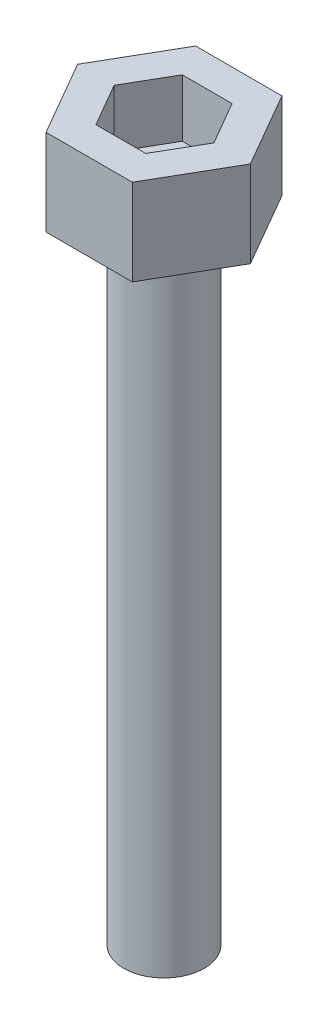
ISO-10303-21;
HEADER;
FILE_DESCRIPTION(('STEP AP214'),'2;1');
FILE_NAME('part.step','',(''),(''),'','','');
FILE_SCHEMA(('AUTOMOTIVE_DESIGN { 1 0 10303 214 1 1 1 1 }'));
ENDSEC;
DATA;
#1=APPLICATION_CONTEXT('core data for automotive mechanical design processes');
#2=APPLICATION_PROTOCOL_DEFINITION('international standard','automotive_design',2000,#1);
#3=PRODUCT_CONTEXT('',#1,'mechanical');
#4=PRODUCT('Part','Part','',(#3));
#5=PRODUCT_RELATED_PRODUCT_CATEGORY('part','',(#4));
#6=PRODUCT_DEFINITION_FORMATION('','',#4);
#7=PRODUCT_DEFINITION_CONTEXT('part definition',#1,'design');
#8=PRODUCT_DEFINITION('design','',#6,#7);
#9=PRODUCT_DEFINITION_SHAPE('','',#8);
#10=(LENGTH_UNIT() NAMED_UNIT(*) SI_UNIT(.MILLI.,.METRE.));
#11=(NAMED_UNIT(*) PLANE_ANGLE_UNIT() SI_UNIT($,.RADIAN.));
#12=(NAMED_UNIT(*) SI_UNIT($,.STERADIAN.) SOLID_ANGLE_UNIT());
#13=UNCERTAINTY_MEASURE_WITH_UNIT(LENGTH_MEASURE(1.E-05),#10,'distance_accuracy_value','');
#14=(GEOMETRIC_REPRESENTATION_CONTEXT(3) GLOBAL_UNCERTAINTY_ASSIGNED_CONTEXT((#13)) GLOBAL_UNIT_ASSIGNED_CONTEXT((#10,
#11,#12)) REPRESENTATION_CONTEXT('',''));
#15=CARTESIAN_POINT('',(0.,0.,0.));
#16=DIRECTION('',(0.,0.,1.));
#17=DIRECTION('',(1.,0.,0.));
#18=AXIS2_PLACEMENT_3D('',#15,#16,#17);
#19=CARTESIAN_POINT('',(0.,22.,0.));
#20=DIRECTION('',(0.,-1.,0.));
#21=DIRECTION('',(0.,0.,-1.));
#22=AXIS2_PLACEMENT_3D('',#19,#20,#21);
#23=CYLINDRICAL_SURFACE('',#22,1.4);
#24=CARTESIAN_POINT('',(0.,22.,0.));
#25=DIRECTION('',(0.,1.,0.));
#26=DIRECTION('',(0.,0.,1.));
#27=AXIS2_PLACEMENT_3D('',#24,#25,#26);
#28=CIRCLE('',#27,1.4);
#29=CARTESIAN_POINT('',(0.,22.,1.4));
#30=VERTEX_POINT('',#29);
#31=EDGE_CURVE('E11',#30,#30,#28,.T.);
#32=ORIENTED_EDGE('',*,*,#31,.F.);
#33=EDGE_LOOP('',(#32));
#34=FACE_BOUND('',#33,.T.);
#35=CARTESIAN_POINT('',(0.,0.,0.));
#36=DIRECTION('',(0.,1.,0.));
#37=DIRECTION('',(0.,0.,1.));
#38=AXIS2_PLACEMENT_3D('',#35,#36,#37);
#39=CIRCLE('',#38,1.4);
#40=CARTESIAN_POINT('',(0.,0.,1.4));
#41=VERTEX_POINT('',#40);
#42=EDGE_CURVE('E48',#41,#41,#39,.T.);
#43=ORIENTED_EDGE('',*,*,#42,.T.);
#44=EDGE_LOOP('',(#43));
#45=FACE_BOUND('',#44,.T.);
#46=ADVANCED_FACE('F45',(#34,#45),#23,.T.);
#47=CARTESIAN_POINT('',(0.,0.,0.));
#48=DIRECTION('',(0.,1.,0.));
#49=DIRECTION('',(0.,0.,1.));
#50=AXIS2_PLACEMENT_3D('',#47,#48,#49);
#51=PLANE('',#50);
#52=ORIENTED_EDGE('',*,*,#42,.F.);
#53=EDGE_LOOP('',(#52));
#54=FACE_BOUND('',#53,.T.);
#55=ADVANCED_FACE('F184',(#54),#51,.F.);
#56=CARTESIAN_POINT('',(1.50000000000003,25.,2.5980762113533));
#57=DIRECTION('',(-0.866025403784441,0.,-0.499999999999995));
#58=DIRECTION('',(-0.499999999999995,0.,0.866025403784441));
#59=AXIS2_PLACEMENT_3D('',#56,#57,#58);
#60=PLANE('',#59);
#61=DIRECTION('',(0.499999999999995,0.,-0.866025403784441));
#62=VECTOR('',#61,1.);
#63=CARTESIAN_POINT('',(1.50000000000003,22.,2.5980762113533));
#64=LINE('',#63,#62);
#65=CARTESIAN_POINT('',(1.50000000000003,22.,2.5980762113533));
#66=VERTEX_POINT('',#65);
#67=CARTESIAN_POINT('',(3.,22.,0.));
#68=VERTEX_POINT('',#67);
#69=EDGE_CURVE('E147',#66,#68,#64,.T.);
#70=ORIENTED_EDGE('',*,*,#69,.T.);
#71=DIRECTION('',(0.,-1.,0.));
#72=VECTOR('',#71,1.);
#73=CARTESIAN_POINT('',(3.,25.,0.));
#74=LINE('',#73,#72);
#75=CARTESIAN_POINT('',(3.,25.,0.));
#76=VERTEX_POINT('',#75);
#77=EDGE_CURVE('E176',#76,#68,#74,.T.);
#78=ORIENTED_EDGE('',*,*,#77,.F.);
#79=DIRECTION('',(0.499999999999995,0.,-0.866025403784441));
#80=VECTOR('',#79,1.);
#81=CARTESIAN_POINT('',(1.50000000000003,25.,2.5980762113533));
#82=LINE('',#81,#80);
#83=CARTESIAN_POINT('',(1.50000000000003,25.,2.5980762113533));
#84=VERTEX_POINT('',#83);
#85=EDGE_CURVE('E165',#84,#76,#82,.T.);
#86=ORIENTED_EDGE('',*,*,#85,.F.);
#87=DIRECTION('',(0.,-1.,0.));
#88=VECTOR('',#87,1.);
#89=CARTESIAN_POINT('',(1.50000000000003,25.,2.5980762113533));
#90=LINE('',#89,#88);
#91=EDGE_CURVE('E143',#84,#66,#90,.T.);
#92=ORIENTED_EDGE('',*,*,#91,.T.);
#93=EDGE_LOOP('',(#70,#78,#86,#92));
#94=FACE_BOUND('',#93,.T.);
#95=ADVANCED_FACE('F186',(#94),#60,.F.);
#96=CARTESIAN_POINT('',(3.,25.,0.));
#97=DIRECTION('',(-0.866025403784438,0.,0.500000000000001));
#98=DIRECTION('',(0.500000000000001,0.,0.866025403784438));
#99=AXIS2_PLACEMENT_3D('',#96,#97,#98);
#100=PLANE('',#99);
#101=DIRECTION('',(-0.500000000000001,0.,-0.866025403784438));
#102=VECTOR('',#101,1.);
#103=CARTESIAN_POINT('',(3.,22.,0.));
#104=LINE('',#103,#102);
#105=CARTESIAN_POINT('',(1.49999999999999,22.,-2.59807621135332));
#106=VERTEX_POINT('',#105);
#107=EDGE_CURVE('E151',#68,#106,#104,.T.);
#108=ORIENTED_EDGE('',*,*,#107,.T.);
#109=DIRECTION('',(0.,-1.,0.));
#110=VECTOR('',#109,1.);
#111=CARTESIAN_POINT('',(1.49999999999999,25.,-2.59807621135332));
#112=LINE('',#111,#110);
#113=CARTESIAN_POINT('',(1.49999999999999,25.,-2.59807621135332));
#114=VERTEX_POINT('',#113);
#115=EDGE_CURVE('E172',#114,#106,#112,.T.);
#116=ORIENTED_EDGE('',*,*,#115,.F.);
#117=DIRECTION('',(-0.500000000000001,0.,-0.866025403784438));
#118=VECTOR('',#117,1.);
#119=CARTESIAN_POINT('',(3.,25.,0.));
#120=LINE('',#119,#118);
#121=EDGE_CURVE('E105',#76,#114,#120,.T.);
#122=ORIENTED_EDGE('',*,*,#121,.F.);
#123=ORIENTED_EDGE('',*,*,#77,.T.);
#124=EDGE_LOOP('',(#108,#116,#122,#123));
#125=FACE_BOUND('',#124,.T.);
#126=ADVANCED_FACE('F191',(#125),#100,.F.);
#127=CARTESIAN_POINT('',(1.49999999999999,25.,-2.59807621135332));
#128=DIRECTION('',(0.,0.,1.));
#129=DIRECTION('',(1.,0.,0.));
#130=AXIS2_PLACEMENT_3D('',#127,#128,#129);
#131=PLANE('',#130);
#132=DIRECTION('',(-1.,0.,0.));
#133=VECTOR('',#132,1.);
#134=CARTESIAN_POINT('',(1.49999999999999,22.,-2.59807621135332));
#135=LINE('',#134,#133);
#136=CARTESIAN_POINT('',(-1.50000000000001,22.,-2.59807621135331));
#137=VERTEX_POINT('',#136);
#138=EDGE_CURVE('E155',#106,#137,#135,.T.);
#139=ORIENTED_EDGE('',*,*,#138,.T.);
#140=DIRECTION('',(0.,-1.,0.));
#141=VECTOR('',#140,1.);
#142=CARTESIAN_POINT('',(-1.50000000000001,25.,-2.59807621135331));
#143=LINE('',#142,#141);
#144=CARTESIAN_POINT('',(-1.50000000000001,25.,-2.59807621135331));
#145=VERTEX_POINT('',#144);
#146=EDGE_CURVE('E136',#145,#137,#143,.T.);
#147=ORIENTED_EDGE('',*,*,#146,.F.);
#148=DIRECTION('',(-1.,0.,0.));
#149=VECTOR('',#148,1.);
#150=CARTESIAN_POINT('',(1.49999999999999,25.,-2.59807621135332));
#151=LINE('',#150,#149);
#152=EDGE_CURVE('E122',#114,#145,#151,.T.);
#153=ORIENTED_EDGE('',*,*,#152,.F.);
#154=ORIENTED_EDGE('',*,*,#115,.T.);
#155=EDGE_LOOP('',(#139,#147,#153,#154));
#156=FACE_BOUND('',#155,.T.);
#157=ADVANCED_FACE('F198',(#156),#131,.F.);
#158=CARTESIAN_POINT('',(-1.50000000000001,25.,-2.59807621135331));
#159=DIRECTION('',(0.866025403784442,0.,0.499999999999995));
#160=DIRECTION('',(0.499999999999995,0.,-0.866025403784442));
#161=AXIS2_PLACEMENT_3D('',#158,#159,#160);
#162=PLANE('',#161);
#163=DIRECTION('',(-0.499999999999995,0.,0.866025403784441));
#164=VECTOR('',#163,1.);
#165=CARTESIAN_POINT('',(-1.50000000000001,22.,-2.59807621135331));
#166=LINE('',#165,#164);
#167=CARTESIAN_POINT('',(-3.,22.,0.));
#168=VERTEX_POINT('',#167);
#169=EDGE_CURVE('E132',#137,#168,#166,.T.);
#170=ORIENTED_EDGE('',*,*,#169,.T.);
#171=DIRECTION('',(0.,-1.,0.));
#172=VECTOR('',#171,1.);
#173=CARTESIAN_POINT('',(-3.,25.,0.));
#174=LINE('',#173,#172);
#175=CARTESIAN_POINT('',(-3.,25.,0.));
#176=VERTEX_POINT('',#175);
#177=EDGE_CURVE('E129',#176,#168,#174,.T.);
#178=ORIENTED_EDGE('',*,*,#177,.F.);
#179=DIRECTION('',(-0.499999999999995,0.,0.866025403784441));
#180=VECTOR('',#179,1.);
#181=CARTESIAN_POINT('',(-1.50000000000001,25.,-2.59807621135331));
#182=LINE('',#181,#180);
#183=EDGE_CURVE('E115',#145,#176,#182,.T.);
#184=ORIENTED_EDGE('',*,*,#183,.F.);
#185=ORIENTED_EDGE('',*,*,#146,.T.);
#186=EDGE_LOOP('',(#170,#178,#184,#185));
#187=FACE_BOUND('',#186,.T.);
#188=ADVANCED_FACE('F130',(#187),#162,.F.);
#189=CARTESIAN_POINT('',(-3.,25.,0.));
#190=DIRECTION('',(0.866025403784435,0.,-0.500000000000007));
#191=DIRECTION('',(-0.500000000000007,0.,-0.866025403784434));
#192=AXIS2_PLACEMENT_3D('',#189,#190,#191);
#193=PLANE('',#192);
#194=DIRECTION('',(0.500000000000007,0.,0.866025403784434));
#195=VECTOR('',#194,1.);
#196=CARTESIAN_POINT('',(-3.,22.,0.));
#197=LINE('',#196,#195);
#198=CARTESIAN_POINT('',(-1.49999999999998,22.,2.59807621135333));
#199=VERTEX_POINT('',#198);
#200=EDGE_CURVE('E160',#168,#199,#197,.T.);
#201=ORIENTED_EDGE('',*,*,#200,.T.);
#202=DIRECTION('',(0.,-1.,0.));
#203=VECTOR('',#202,1.);
#204=CARTESIAN_POINT('',(-1.49999999999998,25.,2.59807621135333));
#205=LINE('',#204,#203);
#206=CARTESIAN_POINT('',(-1.49999999999998,25.,2.59807621135333));
#207=VERTEX_POINT('',#206);
#208=EDGE_CURVE('E137',#207,#199,#205,.T.);
#209=ORIENTED_EDGE('',*,*,#208,.F.);
#210=DIRECTION('',(0.500000000000007,0.,0.866025403784434));
#211=VECTOR('',#210,1.);
#212=CARTESIAN_POINT('',(-3.,25.,0.));
#213=LINE('',#212,#211);
#214=EDGE_CURVE('E119',#176,#207,#213,.T.);
#215=ORIENTED_EDGE('',*,*,#214,.F.);
#216=ORIENTED_EDGE('',*,*,#177,.T.);
#217=EDGE_LOOP('',(#201,#209,#215,#216));
#218=FACE_BOUND('',#217,.T.);
#219=ADVANCED_FACE('F139',(#218),#193,.F.);
#220=CARTESIAN_POINT('',(-1.49999999999998,25.,2.59807621135333));
#221=DIRECTION('',(0.,0.,-1.));
#222=DIRECTION('',(-1.,0.,0.));
#223=AXIS2_PLACEMENT_3D('',#220,#221,#222);
#224=PLANE('',#223);
#225=DIRECTION('',(1.,0.,0.));
#226=VECTOR('',#225,1.);
#227=CARTESIAN_POINT('',(-1.49999999999998,22.,2.59807621135333));
#228=LINE('',#227,#226);
#229=EDGE_CURVE('E96',#199,#66,#228,.T.);
#230=ORIENTED_EDGE('',*,*,#229,.T.);
#231=ORIENTED_EDGE('',*,*,#91,.F.);
#232=DIRECTION('',(1.,0.,0.));
#233=VECTOR('',#232,1.);
#234=CARTESIAN_POINT('',(-1.49999999999998,25.,2.59807621135333));
#235=LINE('',#234,#233);
#236=EDGE_CURVE('E69',#207,#84,#235,.T.);
#237=ORIENTED_EDGE('',*,*,#236,.F.);
#238=ORIENTED_EDGE('',*,*,#208,.T.);
#239=EDGE_LOOP('',(#230,#231,#237,#238));
#240=FACE_BOUND('',#239,.T.);
#241=ADVANCED_FACE('F206',(#240),#224,.F.);
#242=CARTESIAN_POINT('',(0.,25.,0.));
#243=DIRECTION('',(0.,1.,0.));
#244=DIRECTION('',(0.,0.,1.));
#245=AXIS2_PLACEMENT_3D('',#242,#243,#244);
#246=PLANE('',#245);
#247=DIRECTION('',(0.5,0.,-0.866025403784439));
#248=VECTOR('',#247,1.);
#249=CARTESIAN_POINT('',(0.866025403784438,25.,1.5));
#250=LINE('',#249,#248);
#251=CARTESIAN_POINT('',(0.866025403784438,25.,1.5));
#252=VERTEX_POINT('',#251);
#253=CARTESIAN_POINT('',(1.73205080756888,25.,0.));
#254=VERTEX_POINT('',#253);
#255=EDGE_CURVE('E60',#252,#254,#250,.T.);
#256=ORIENTED_EDGE('',*,*,#255,.F.);
#257=DIRECTION('',(1.,0.,0.));
#258=VECTOR('',#257,1.);
#259=CARTESIAN_POINT('',(-0.86602540378444,25.,1.5));
#260=LINE('',#259,#258);
#261=CARTESIAN_POINT('',(-0.86602540378444,25.,1.5));
#262=VERTEX_POINT('',#261);
#263=EDGE_CURVE('E259',#262,#252,#260,.T.);
#264=ORIENTED_EDGE('',*,*,#263,.F.);
#265=DIRECTION('',(0.5,0.,0.866025403784439));
#266=VECTOR('',#265,1.);
#267=CARTESIAN_POINT('',(-1.73205080756888,25.,0.));
#268=LINE('',#267,#266);
#269=CARTESIAN_POINT('',(-1.73205080756888,25.,0.));
#270=VERTEX_POINT('',#269);
#271=EDGE_CURVE('E266',#270,#262,#268,.T.);
#272=ORIENTED_EDGE('',*,*,#271,.F.);
#273=DIRECTION('',(-0.5,0.,0.866025403784439));
#274=VECTOR('',#273,1.);
#275=CARTESIAN_POINT('',(-0.866025403784439,25.,-1.5));
#276=LINE('',#275,#274);
#277=CARTESIAN_POINT('',(-0.866025403784439,25.,-1.5));
#278=VERTEX_POINT('',#277);
#279=EDGE_CURVE('E291',#278,#270,#276,.T.);
#280=ORIENTED_EDGE('',*,*,#279,.F.);
#281=DIRECTION('',(-1.,0.,0.));
#282=VECTOR('',#281,1.);
#283=CARTESIAN_POINT('',(0.866025403784437,25.,-1.5));
#284=LINE('',#283,#282);
#285=CARTESIAN_POINT('',(0.866025403784437,25.,-1.5));
#286=VERTEX_POINT('',#285);
#287=EDGE_CURVE('E287',#286,#278,#284,.T.);
#288=ORIENTED_EDGE('',*,*,#287,.F.);
#289=DIRECTION('',(-0.5,0.,-0.866025403784438));
#290=VECTOR('',#289,1.);
#291=CARTESIAN_POINT('',(1.73205080756888,25.,0.));
#292=LINE('',#291,#290);
#293=EDGE_CURVE('E283',#254,#286,#292,.T.);
#294=ORIENTED_EDGE('',*,*,#293,.F.);
#295=EDGE_LOOP('',(#256,#264,#272,#280,#288,#294));
#296=FACE_BOUND('',#295,.T.);
#297=ORIENTED_EDGE('',*,*,#85,.T.);
#298=ORIENTED_EDGE('',*,*,#121,.T.);
#299=ORIENTED_EDGE('',*,*,#152,.T.);
#300=ORIENTED_EDGE('',*,*,#183,.T.);
#301=ORIENTED_EDGE('',*,*,#214,.T.);
#302=ORIENTED_EDGE('',*,*,#236,.T.);
#303=EDGE_LOOP('',(#297,#298,#299,#300,#301,#302));
#304=FACE_BOUND('',#303,.T.);
#305=ADVANCED_FACE('F117',(#296,#304),#246,.T.);
#306=CARTESIAN_POINT('',(0.,22.,0.));
#307=DIRECTION('',(0.,1.,0.));
#308=DIRECTION('',(0.,0.,1.));
#309=AXIS2_PLACEMENT_3D('',#306,#307,#308);
#310=PLANE('',#309);
#311=ORIENTED_EDGE('',*,*,#31,.T.);
#312=EDGE_LOOP('',(#311));
#313=FACE_BOUND('',#312,.T.);
#314=ORIENTED_EDGE('',*,*,#69,.F.);
#315=ORIENTED_EDGE('',*,*,#229,.F.);
#316=ORIENTED_EDGE('',*,*,#200,.F.);
#317=ORIENTED_EDGE('',*,*,#169,.F.);
#318=ORIENTED_EDGE('',*,*,#138,.F.);
#319=ORIENTED_EDGE('',*,*,#107,.F.);
#320=EDGE_LOOP('',(#314,#315,#316,#317,#318,#319));
#321=FACE_BOUND('',#320,.T.);
#322=ADVANCED_FACE('F209',(#313,#321),#310,.F.);
#323=CARTESIAN_POINT('',(0.866025403784438,23.,1.5));
#324=DIRECTION('',(0.866025403784439,0.,0.5));
#325=DIRECTION('',(0.5,0.,-0.866025403784439));
#326=AXIS2_PLACEMENT_3D('',#323,#324,#325);
#327=PLANE('',#326);
#328=ORIENTED_EDGE('',*,*,#255,.T.);
#329=DIRECTION('',(0.,1.,0.));
#330=VECTOR('',#329,1.);
#331=CARTESIAN_POINT('',(1.73205080756888,23.,0.));
#332=LINE('',#331,#330);
#333=CARTESIAN_POINT('',(1.73205080756888,23.,0.));
#334=VERTEX_POINT('',#333);
#335=EDGE_CURVE('E280',#334,#254,#332,.T.);
#336=ORIENTED_EDGE('',*,*,#335,.F.);
#337=DIRECTION('',(0.5,0.,-0.866025403784439));
#338=VECTOR('',#337,1.);
#339=CARTESIAN_POINT('',(0.866025403784438,23.,1.5));
#340=LINE('',#339,#338);
#341=CARTESIAN_POINT('',(0.866025403784438,23.,1.5));
#342=VERTEX_POINT('',#341);
#343=EDGE_CURVE('E249',#342,#334,#340,.T.);
#344=ORIENTED_EDGE('',*,*,#343,.F.);
#345=DIRECTION('',(0.,1.,0.));
#346=VECTOR('',#345,1.);
#347=CARTESIAN_POINT('',(0.866025403784438,23.,1.5));
#348=LINE('',#347,#346);
#349=EDGE_CURVE('E152',#342,#252,#348,.T.);
#350=ORIENTED_EDGE('',*,*,#349,.T.);
#351=EDGE_LOOP('',(#328,#336,#344,#350));
#352=FACE_BOUND('',#351,.T.);
#353=ADVANCED_FACE('F212',(#352),#327,.F.);
#354=CARTESIAN_POINT('',(-0.86602540378444,23.,1.5));
#355=DIRECTION('',(0.,0.,1.));
#356=DIRECTION('',(1.,0.,0.));
#357=AXIS2_PLACEMENT_3D('',#354,#355,#356);
#358=PLANE('',#357);
#359=ORIENTED_EDGE('',*,*,#263,.T.);
#360=ORIENTED_EDGE('',*,*,#349,.F.);
#361=DIRECTION('',(1.,0.,0.));
#362=VECTOR('',#361,1.);
#363=CARTESIAN_POINT('',(-0.86602540378444,23.,1.5));
#364=LINE('',#363,#362);
#365=CARTESIAN_POINT('',(-0.86602540378444,23.,1.5));
#366=VERTEX_POINT('',#365);
#367=EDGE_CURVE('E256',#366,#342,#364,.T.);
#368=ORIENTED_EDGE('',*,*,#367,.F.);
#369=DIRECTION('',(0.,1.,0.));
#370=VECTOR('',#369,1.);
#371=CARTESIAN_POINT('',(-0.86602540378444,23.,1.5));
#372=LINE('',#371,#370);
#373=EDGE_CURVE('E300',#366,#262,#372,.T.);
#374=ORIENTED_EDGE('',*,*,#373,.T.);
#375=EDGE_LOOP('',(#359,#360,#368,#374));
#376=FACE_BOUND('',#375,.T.);
#377=ADVANCED_FACE('F219',(#376),#358,.F.);
#378=CARTESIAN_POINT('',(-1.73205080756888,23.,0.));
#379=DIRECTION('',(-0.866025403784439,0.,0.5));
#380=DIRECTION('',(0.5,0.,0.866025403784439));
#381=AXIS2_PLACEMENT_3D('',#378,#379,#380);
#382=PLANE('',#381);
#383=ORIENTED_EDGE('',*,*,#271,.T.);
#384=ORIENTED_EDGE('',*,*,#373,.F.);
#385=DIRECTION('',(0.5,0.,0.866025403784439));
#386=VECTOR('',#385,1.);
#387=CARTESIAN_POINT('',(-1.73205080756888,23.,0.));
#388=LINE('',#387,#386);
#389=CARTESIAN_POINT('',(-1.73205080756888,23.,0.));
#390=VERTEX_POINT('',#389);
#391=EDGE_CURVE('E275',#390,#366,#388,.T.);
#392=ORIENTED_EDGE('',*,*,#391,.F.);
#393=DIRECTION('',(0.,1.,0.));
#394=VECTOR('',#393,1.);
#395=CARTESIAN_POINT('',(-1.73205080756888,23.,0.));
#396=LINE('',#395,#394);
#397=EDGE_CURVE('E304',#390,#270,#396,.T.);
#398=ORIENTED_EDGE('',*,*,#397,.T.);
#399=EDGE_LOOP('',(#383,#384,#392,#398));
#400=FACE_BOUND('',#399,.T.);
#401=ADVANCED_FACE('F232',(#400),#382,.F.);
#402=CARTESIAN_POINT('',(-0.866025403784439,23.,-1.5));
#403=DIRECTION('',(-0.866025403784439,0.,-0.5));
#404=DIRECTION('',(-0.5,0.,0.866025403784439));
#405=AXIS2_PLACEMENT_3D('',#402,#403,#404);
#406=PLANE('',#405);
#407=ORIENTED_EDGE('',*,*,#279,.T.);
#408=ORIENTED_EDGE('',*,*,#397,.F.);
#409=DIRECTION('',(-0.5,0.,0.866025403784439));
#410=VECTOR('',#409,1.);
#411=CARTESIAN_POINT('',(-0.866025403784439,23.,-1.5));
#412=LINE('',#411,#410);
#413=CARTESIAN_POINT('',(-0.866025403784439,23.,-1.5));
#414=VERTEX_POINT('',#413);
#415=EDGE_CURVE('E271',#414,#390,#412,.T.);
#416=ORIENTED_EDGE('',*,*,#415,.F.);
#417=DIRECTION('',(0.,1.,0.));
#418=VECTOR('',#417,1.);
#419=CARTESIAN_POINT('',(-0.866025403784439,23.,-1.5));
#420=LINE('',#419,#418);
#421=EDGE_CURVE('E308',#414,#278,#420,.T.);
#422=ORIENTED_EDGE('',*,*,#421,.T.);
#423=EDGE_LOOP('',(#407,#408,#416,#422));
#424=FACE_BOUND('',#423,.T.);
#425=ADVANCED_FACE('F228',(#424),#406,.F.);
#426=CARTESIAN_POINT('',(0.866025403784437,23.,-1.5));
#427=DIRECTION('',(0.,0.,-1.));
#428=DIRECTION('',(-1.,0.,0.));
#429=AXIS2_PLACEMENT_3D('',#426,#427,#428);
#430=PLANE('',#429);
#431=ORIENTED_EDGE('',*,*,#287,.T.);
#432=ORIENTED_EDGE('',*,*,#421,.F.);
#433=DIRECTION('',(-1.,0.,0.));
#434=VECTOR('',#433,1.);
#435=CARTESIAN_POINT('',(0.866025403784437,23.,-1.5));
#436=LINE('',#435,#434);
#437=CARTESIAN_POINT('',(0.866025403784437,23.,-1.5));
#438=VERTEX_POINT('',#437);
#439=EDGE_CURVE('E263',#438,#414,#436,.T.);
#440=ORIENTED_EDGE('',*,*,#439,.F.);
#441=DIRECTION('',(0.,1.,0.));
#442=VECTOR('',#441,1.);
#443=CARTESIAN_POINT('',(0.866025403784437,23.,-1.5));
#444=LINE('',#443,#442);
#445=EDGE_CURVE('E312',#438,#286,#444,.T.);
#446=ORIENTED_EDGE('',*,*,#445,.T.);
#447=EDGE_LOOP('',(#431,#432,#440,#446));
#448=FACE_BOUND('',#447,.T.);
#449=ADVANCED_FACE('F224',(#448),#430,.F.);
#450=CARTESIAN_POINT('',(1.73205080756888,23.,0.));
#451=DIRECTION('',(0.866025403784439,0.,-0.5));
#452=DIRECTION('',(-0.5,0.,-0.866025403784439));
#453=AXIS2_PLACEMENT_3D('',#450,#451,#452);
#454=PLANE('',#453);
#455=ORIENTED_EDGE('',*,*,#293,.T.);
#456=ORIENTED_EDGE('',*,*,#445,.F.);
#457=DIRECTION('',(-0.5,0.,-0.866025403784438));
#458=VECTOR('',#457,1.);
#459=CARTESIAN_POINT('',(1.73205080756888,23.,0.));
#460=LINE('',#459,#458);
#461=EDGE_CURVE('E253',#334,#438,#460,.T.);
#462=ORIENTED_EDGE('',*,*,#461,.F.);
#463=ORIENTED_EDGE('',*,*,#335,.T.);
#464=EDGE_LOOP('',(#455,#456,#462,#463));
#465=FACE_BOUND('',#464,.T.);
#466=ADVANCED_FACE('F220',(#465),#454,.F.);
#467=CARTESIAN_POINT('',(0.,23.,0.));
#468=DIRECTION('',(0.,1.,0.));
#469=DIRECTION('',(0.,0.,1.));
#470=AXIS2_PLACEMENT_3D('',#467,#468,#469);
#471=PLANE('',#470);
#472=ORIENTED_EDGE('',*,*,#343,.T.);
#473=ORIENTED_EDGE('',*,*,#461,.T.);
#474=ORIENTED_EDGE('',*,*,#439,.T.);
#475=ORIENTED_EDGE('',*,*,#415,.T.);
#476=ORIENTED_EDGE('',*,*,#391,.T.);
#477=ORIENTED_EDGE('',*,*,#367,.T.);
#478=EDGE_LOOP('',(#472,#473,#474,#475,#476,#477));
#479=FACE_BOUND('',#478,.T.);
#480=ADVANCED_FACE('F223',(#479),#471,.T.);
#481=CLOSED_SHELL('',(#46,#55,#95,#126,#157,#188,#219,#241,#305,#322,#353,#377,#401,#425,#449,
#466,#480));
#482=MANIFOLD_SOLID_BREP('B2',#481);
#483=ADVANCED_BREP_SHAPE_REPRESENTATION('',(#18,#482),#14);
#484=SHAPE_DEFINITION_REPRESENTATION(#9,#483);
ENDSEC;
END-ISO-10303-21;
